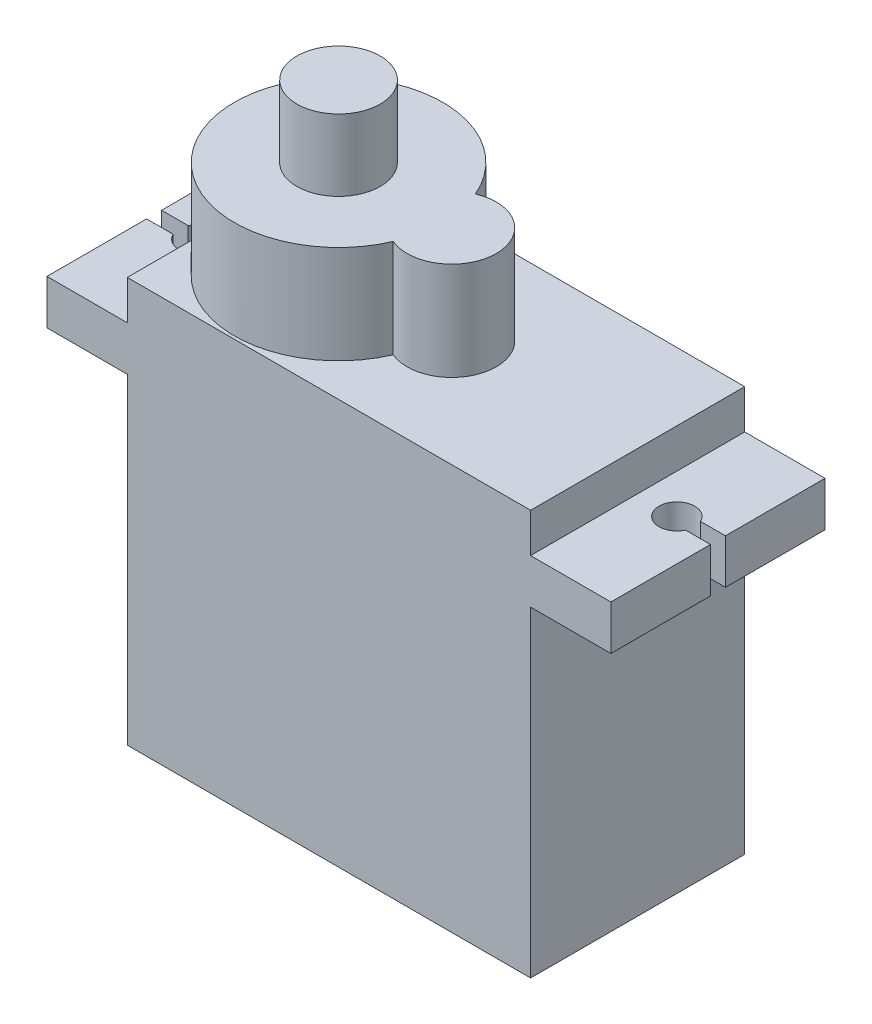
ISO-10303-21;
HEADER;
FILE_DESCRIPTION(('STEP AP214'),'2;1');
FILE_NAME('part.step','',(''),(''),'','','');
FILE_SCHEMA(('AUTOMOTIVE_DESIGN { 1 0 10303 214 1 1 1 1 }'));
ENDSEC;
DATA;
#1=APPLICATION_CONTEXT('core data for automotive mechanical design processes');
#2=APPLICATION_PROTOCOL_DEFINITION('international standard','automotive_design',2000,#1);
#3=PRODUCT_CONTEXT('',#1,'mechanical');
#4=PRODUCT('Part','Part','',(#3));
#5=PRODUCT_RELATED_PRODUCT_CATEGORY('part','',(#4));
#6=PRODUCT_DEFINITION_FORMATION('','',#4);
#7=PRODUCT_DEFINITION_CONTEXT('part definition',#1,'design');
#8=PRODUCT_DEFINITION('design','',#6,#7);
#9=PRODUCT_DEFINITION_SHAPE('','',#8);
#10=(LENGTH_UNIT() NAMED_UNIT(*) SI_UNIT(.MILLI.,.METRE.));
#11=(NAMED_UNIT(*) PLANE_ANGLE_UNIT() SI_UNIT($,.RADIAN.));
#12=(NAMED_UNIT(*) SI_UNIT($,.STERADIAN.) SOLID_ANGLE_UNIT());
#13=UNCERTAINTY_MEASURE_WITH_UNIT(LENGTH_MEASURE(1.E-05),#10,'distance_accuracy_value','');
#14=(GEOMETRIC_REPRESENTATION_CONTEXT(3) GLOBAL_UNCERTAINTY_ASSIGNED_CONTEXT((#13)) GLOBAL_UNIT_ASSIGNED_CONTEXT((#10,
#11,#12)) REPRESENTATION_CONTEXT('',''));
#15=CARTESIAN_POINT('',(0.,0.,0.));
#16=DIRECTION('',(0.,0.,1.));
#17=DIRECTION('',(1.,0.,0.));
#18=AXIS2_PLACEMENT_3D('',#15,#16,#17);
#19=CARTESIAN_POINT('',(-50.695532413833,18.,0.));
#20=DIRECTION('',(0.,-1.,0.));
#21=DIRECTION('',(0.,0.,-1.));
#22=AXIS2_PLACEMENT_3D('',#19,#20,#21);
#23=PLANE('',#22);
#24=CARTESIAN_POINT('',(-48.295532413833,18.,1.25686180578578));
#25=DIRECTION('',(0.,-1.,0.));
#26=DIRECTION('',(0.,0.,-1.));
#27=AXIS2_PLACEMENT_3D('',#24,#25,#26);
#28=CIRCLE('',#27,0.999999999999998);
#29=CARTESIAN_POINT('',(-49.2030565181961,18.,0.836861805785775));
#30=VERTEX_POINT('',#29);
#31=CARTESIAN_POINT('',(-49.2030565181961,18.,1.67686180578578));
#32=VERTEX_POINT('',#31);
#33=EDGE_CURVE('E225',#30,#32,#28,.T.);
#34=ORIENTED_EDGE('',*,*,#33,.F.);
#35=DIRECTION('',(-1.,0.,0.));
#36=VECTOR('',#35,1.);
#37=CARTESIAN_POINT('',(-50.695532413833,18.,0.836861805785776));
#38=LINE('',#37,#36);
#39=CARTESIAN_POINT('',(-50.695532413833,18.,0.836861805785776));
#40=VERTEX_POINT('',#39);
#41=EDGE_CURVE('E394',#30,#40,#38,.T.);
#42=ORIENTED_EDGE('',*,*,#41,.T.);
#43=DIRECTION('',(0.,0.,-1.));
#44=VECTOR('',#43,1.);
#45=CARTESIAN_POINT('',(-50.695532413833,18.,0.));
#46=LINE('',#45,#44);
#47=CARTESIAN_POINT('',(-50.695532413833,18.,-4.74313819421423));
#48=VERTEX_POINT('',#47);
#49=EDGE_CURVE('E228',#40,#48,#46,.T.);
#50=ORIENTED_EDGE('',*,*,#49,.T.);
#51=DIRECTION('',(1.,0.,0.));
#52=VECTOR('',#51,1.);
#53=CARTESIAN_POINT('',(-50.695532413833,18.,-4.74313819421423));
#54=LINE('',#53,#52);
#55=CARTESIAN_POINT('',(-46.195532413833,18.,-4.74313819421423));
#56=VERTEX_POINT('',#55);
#57=EDGE_CURVE('E217',#48,#56,#54,.T.);
#58=ORIENTED_EDGE('',*,*,#57,.T.);
#59=DIRECTION('',(0.,0.,-1.));
#60=VECTOR('',#59,1.);
#61=CARTESIAN_POINT('',(-46.195532413833,18.,0.));
#62=LINE('',#61,#60);
#63=CARTESIAN_POINT('',(-46.195532413833,18.,7.25686180578577));
#64=VERTEX_POINT('',#63);
#65=EDGE_CURVE('E222',#64,#56,#62,.T.);
#66=ORIENTED_EDGE('',*,*,#65,.F.);
#67=DIRECTION('',(1.,0.,0.));
#68=VECTOR('',#67,1.);
#69=CARTESIAN_POINT('',(-50.695532413833,18.,7.25686180578577));
#70=LINE('',#69,#68);
#71=CARTESIAN_POINT('',(-50.695532413833,18.,7.25686180578577));
#72=VERTEX_POINT('',#71);
#73=EDGE_CURVE('E236',#72,#64,#70,.T.);
#74=ORIENTED_EDGE('',*,*,#73,.F.);
#75=CARTESIAN_POINT('',(-50.695532413833,18.,1.67686180578578));
#76=VERTEX_POINT('',#75);
#77=EDGE_CURVE('E397',#72,#76,#46,.T.);
#78=ORIENTED_EDGE('',*,*,#77,.T.);
#79=DIRECTION('',(-1.,0.,0.));
#80=VECTOR('',#79,1.);
#81=CARTESIAN_POINT('',(-50.695532413833,18.,1.67686180578578));
#82=LINE('',#81,#80);
#83=EDGE_CURVE('E54',#32,#76,#82,.T.);
#84=ORIENTED_EDGE('',*,*,#83,.F.);
#85=EDGE_LOOP('',(#34,#42,#50,#58,#66,#74,#78,#84));
#86=FACE_BOUND('',#85,.T.);
#87=ADVANCED_FACE('F39',(#86),#23,.T.);
#88=CARTESIAN_POINT('',(-50.695532413833,20.5,0.));
#89=DIRECTION('',(0.,-1.,0.));
#90=DIRECTION('',(0.,0.,-1.));
#91=AXIS2_PLACEMENT_3D('',#88,#89,#90);
#92=PLANE('',#91);
#93=DIRECTION('',(1.,0.,0.));
#94=VECTOR('',#93,1.);
#95=CARTESIAN_POINT('',(0.,20.5,0.83686180578576));
#96=LINE('',#95,#94);
#97=CARTESIAN_POINT('',(-50.695532413833,20.5,0.836861805785775));
#98=VERTEX_POINT('',#97);
#99=CARTESIAN_POINT('',(-49.2030565181961,20.5,0.836861805785774));
#100=VERTEX_POINT('',#99);
#101=EDGE_CURVE('E384',#98,#100,#96,.T.);
#102=ORIENTED_EDGE('',*,*,#101,.T.);
#103=CARTESIAN_POINT('',(-48.295532413833,20.5,1.25686180578578));
#104=DIRECTION('',(0.,1.,0.));
#105=DIRECTION('',(0.,0.,1.));
#106=AXIS2_PLACEMENT_3D('',#103,#104,#105);
#107=CIRCLE('',#106,0.999999999999998);
#108=CARTESIAN_POINT('',(-49.2030565181961,20.5,1.67686180578578));
#109=VERTEX_POINT('',#108);
#110=EDGE_CURVE('E207',#109,#100,#107,.T.);
#111=ORIENTED_EDGE('',*,*,#110,.F.);
#112=DIRECTION('',(1.,0.,0.));
#113=VECTOR('',#112,1.);
#114=CARTESIAN_POINT('',(0.,20.5,1.67686180578578));
#115=LINE('',#114,#113);
#116=CARTESIAN_POINT('',(-50.695532413833,20.5,1.67686180578578));
#117=VERTEX_POINT('',#116);
#118=EDGE_CURVE('E193',#117,#109,#115,.T.);
#119=ORIENTED_EDGE('',*,*,#118,.F.);
#120=DIRECTION('',(0.,0.,-1.));
#121=VECTOR('',#120,1.);
#122=CARTESIAN_POINT('',(-50.695532413833,20.5,0.));
#123=LINE('',#122,#121);
#124=CARTESIAN_POINT('',(-50.695532413833,20.5,7.25686180578577));
#125=VERTEX_POINT('',#124);
#126=EDGE_CURVE('E205',#125,#117,#123,.T.);
#127=ORIENTED_EDGE('',*,*,#126,.F.);
#128=DIRECTION('',(1.,0.,0.));
#129=VECTOR('',#128,1.);
#130=CARTESIAN_POINT('',(-50.695532413833,20.5,7.25686180578577));
#131=LINE('',#130,#129);
#132=CARTESIAN_POINT('',(-46.195532413833,20.5,7.25686180578577));
#133=VERTEX_POINT('',#132);
#134=EDGE_CURVE('E234',#125,#133,#131,.T.);
#135=ORIENTED_EDGE('',*,*,#134,.T.);
#136=DIRECTION('',(0.,0.,-1.));
#137=VECTOR('',#136,1.);
#138=CARTESIAN_POINT('',(-46.195532413833,20.5,0.));
#139=LINE('',#138,#137);
#140=CARTESIAN_POINT('',(-46.195532413833,20.5,-4.74313819421423));
#141=VERTEX_POINT('',#140);
#142=EDGE_CURVE('E224',#133,#141,#139,.T.);
#143=ORIENTED_EDGE('',*,*,#142,.T.);
#144=DIRECTION('',(1.,0.,0.));
#145=VECTOR('',#144,1.);
#146=CARTESIAN_POINT('',(-50.695532413833,20.5,-4.74313819421423));
#147=LINE('',#146,#145);
#148=CARTESIAN_POINT('',(-50.695532413833,20.5,-4.74313819421423));
#149=VERTEX_POINT('',#148);
#150=EDGE_CURVE('E231',#149,#141,#147,.T.);
#151=ORIENTED_EDGE('',*,*,#150,.F.);
#152=EDGE_CURVE('E214',#98,#149,#123,.T.);
#153=ORIENTED_EDGE('',*,*,#152,.F.);
#154=EDGE_LOOP('',(#102,#111,#119,#127,#135,#143,#151,#153));
#155=FACE_BOUND('',#154,.T.);
#156=ADVANCED_FACE('F203',(#155),#92,.F.);
#157=CARTESIAN_POINT('',(-50.695532413833,0.,0.));
#158=DIRECTION('',(-1.,0.,0.));
#159=DIRECTION('',(0.,0.,1.));
#160=AXIS2_PLACEMENT_3D('',#157,#158,#159);
#161=PLANE('',#160);
#162=ORIENTED_EDGE('',*,*,#49,.F.);
#163=DIRECTION('',(0.,1.,0.));
#164=VECTOR('',#163,1.);
#165=CARTESIAN_POINT('',(-50.695532413833,0.,0.836861805785781));
#166=LINE('',#165,#164);
#167=EDGE_CURVE('E12',#40,#98,#166,.T.);
#168=ORIENTED_EDGE('',*,*,#167,.T.);
#169=ORIENTED_EDGE('',*,*,#152,.T.);
#170=DIRECTION('',(0.,-1.,0.));
#171=VECTOR('',#170,1.);
#172=CARTESIAN_POINT('',(-50.695532413833,0.,-4.74313819421423));
#173=LINE('',#172,#171);
#174=EDGE_CURVE('E213',#149,#48,#173,.T.);
#175=ORIENTED_EDGE('',*,*,#174,.T.);
#176=EDGE_LOOP('',(#162,#168,#169,#175));
#177=FACE_BOUND('',#176,.T.);
#178=ADVANCED_FACE('F383',(#177),#161,.T.);
#179=CARTESIAN_POINT('',(-46.195532413833,22.7,-4.74313819421423));
#180=DIRECTION('',(1.,0.,0.));
#181=DIRECTION('',(0.,0.,-1.));
#182=AXIS2_PLACEMENT_3D('',#179,#180,#181);
#183=PLANE('',#182);
#184=ORIENTED_EDGE('',*,*,#142,.F.);
#185=DIRECTION('',(0.,-1.,0.));
#186=VECTOR('',#185,1.);
#187=CARTESIAN_POINT('',(-46.195532413833,22.7,7.25686180578577));
#188=LINE('',#187,#186);
#189=CARTESIAN_POINT('',(-46.195532413833,22.7,7.25686180578577));
#190=VERTEX_POINT('',#189);
#191=EDGE_CURVE('E310',#190,#133,#188,.T.);
#192=ORIENTED_EDGE('',*,*,#191,.F.);
#193=DIRECTION('',(0.,0.,1.));
#194=VECTOR('',#193,1.);
#195=CARTESIAN_POINT('',(-46.195532413833,22.7,-4.74313819421423));
#196=LINE('',#195,#194);
#197=CARTESIAN_POINT('',(-46.195532413833,22.7,1.25686180578577));
#198=VERTEX_POINT('',#197);
#199=EDGE_CURVE('E668',#198,#190,#196,.T.);
#200=ORIENTED_EDGE('',*,*,#199,.F.);
#201=CARTESIAN_POINT('',(-46.195532413833,22.7,-4.74313819421423));
#202=VERTEX_POINT('',#201);
#203=EDGE_CURVE('E683',#202,#198,#196,.T.);
#204=ORIENTED_EDGE('',*,*,#203,.F.);
#205=DIRECTION('',(0.,-1.,0.));
#206=VECTOR('',#205,1.);
#207=CARTESIAN_POINT('',(-46.195532413833,22.7,-4.74313819421423));
#208=LINE('',#207,#206);
#209=EDGE_CURVE('E359',#202,#141,#208,.T.);
#210=ORIENTED_EDGE('',*,*,#209,.T.);
#211=EDGE_LOOP('',(#184,#192,#200,#204,#210));
#212=FACE_BOUND('',#211,.T.);
#213=ADVANCED_FACE('F435',(#212),#183,.F.);
#214=CARTESIAN_POINT('',(-19.095532413833,18.,0.));
#215=DIRECTION('',(0.,1.,0.));
#216=DIRECTION('',(0.,0.,1.));
#217=AXIS2_PLACEMENT_3D('',#214,#215,#216);
#218=PLANE('',#217);
#219=DIRECTION('',(-1.,0.,0.));
#220=VECTOR('',#219,1.);
#221=CARTESIAN_POINT('',(-19.095532413833,18.,1.67686180578577));
#222=LINE('',#221,#220);
#223=CARTESIAN_POINT('',(-19.095532413833,18.,1.67686180578577));
#224=VERTEX_POINT('',#223);
#225=CARTESIAN_POINT('',(-20.4880083094699,18.,1.67686180578577));
#226=VERTEX_POINT('',#225);
#227=EDGE_CURVE('E254',#224,#226,#222,.T.);
#228=ORIENTED_EDGE('',*,*,#227,.F.);
#229=DIRECTION('',(0.,0.,-1.));
#230=VECTOR('',#229,1.);
#231=CARTESIAN_POINT('',(-19.095532413833,18.,0.));
#232=LINE('',#231,#230);
#233=CARTESIAN_POINT('',(-19.095532413833,18.,7.25686180578577));
#234=VERTEX_POINT('',#233);
#235=EDGE_CURVE('E265',#234,#224,#232,.T.);
#236=ORIENTED_EDGE('',*,*,#235,.F.);
#237=DIRECTION('',(-1.,0.,0.));
#238=VECTOR('',#237,1.);
#239=CARTESIAN_POINT('',(-19.095532413833,18.,7.25686180578577));
#240=LINE('',#239,#238);
#241=CARTESIAN_POINT('',(-23.595532413833,18.,7.25686180578577));
#242=VERTEX_POINT('',#241);
#243=EDGE_CURVE('E290',#234,#242,#240,.T.);
#244=ORIENTED_EDGE('',*,*,#243,.T.);
#245=DIRECTION('',(0.,0.,-1.));
#246=VECTOR('',#245,1.);
#247=CARTESIAN_POINT('',(-23.595532413833,18.,0.));
#248=LINE('',#247,#246);
#249=CARTESIAN_POINT('',(-23.595532413833,18.,-4.74313819421423));
#250=VERTEX_POINT('',#249);
#251=EDGE_CURVE('E259',#242,#250,#248,.T.);
#252=ORIENTED_EDGE('',*,*,#251,.T.);
#253=DIRECTION('',(-1.,0.,0.));
#254=VECTOR('',#253,1.);
#255=CARTESIAN_POINT('',(-19.095532413833,18.,-4.74313819421423));
#256=LINE('',#255,#254);
#257=CARTESIAN_POINT('',(-19.095532413833,18.,-4.74313819421423));
#258=VERTEX_POINT('',#257);
#259=EDGE_CURVE('E287',#258,#250,#256,.T.);
#260=ORIENTED_EDGE('',*,*,#259,.F.);
#261=CARTESIAN_POINT('',(-19.095532413833,18.,0.836861805785775));
#262=VERTEX_POINT('',#261);
#263=EDGE_CURVE('E263',#262,#258,#232,.T.);
#264=ORIENTED_EDGE('',*,*,#263,.F.);
#265=DIRECTION('',(-1.,0.,0.));
#266=VECTOR('',#265,1.);
#267=CARTESIAN_POINT('',(-19.095532413833,18.,0.836861805785775));
#268=LINE('',#267,#266);
#269=CARTESIAN_POINT('',(-20.4880083094699,18.,0.836861805785775));
#270=VERTEX_POINT('',#269);
#271=EDGE_CURVE('E250',#262,#270,#268,.T.);
#272=ORIENTED_EDGE('',*,*,#271,.T.);
#273=CARTESIAN_POINT('',(-21.395532413833,18.,1.25686180578577));
#274=DIRECTION('',(0.,1.,0.));
#275=DIRECTION('',(0.,0.,1.));
#276=AXIS2_PLACEMENT_3D('',#273,#274,#275);
#277=CIRCLE('',#276,1.);
#278=EDGE_CURVE('E256',#270,#226,#277,.T.);
#279=ORIENTED_EDGE('',*,*,#278,.T.);
#280=EDGE_LOOP('',(#228,#236,#244,#252,#260,#264,#272,#279));
#281=FACE_BOUND('',#280,.T.);
#282=ADVANCED_FACE('F329',(#281),#218,.F.);
#283=CARTESIAN_POINT('',(-19.095532413833,20.5,0.));
#284=DIRECTION('',(0.,1.,0.));
#285=DIRECTION('',(0.,0.,1.));
#286=AXIS2_PLACEMENT_3D('',#283,#284,#285);
#287=PLANE('',#286);
#288=DIRECTION('',(0.,0.,-1.));
#289=VECTOR('',#288,1.);
#290=CARTESIAN_POINT('',(-19.095532413833,20.5,0.));
#291=LINE('',#290,#289);
#292=CARTESIAN_POINT('',(-19.095532413833,20.5,7.25686180578577));
#293=VERTEX_POINT('',#292);
#294=CARTESIAN_POINT('',(-19.095532413833,20.5,1.67686180578577));
#295=VERTEX_POINT('',#294);
#296=EDGE_CURVE('E272',#293,#295,#291,.T.);
#297=ORIENTED_EDGE('',*,*,#296,.T.);
#298=DIRECTION('',(-1.,0.,0.));
#299=VECTOR('',#298,1.);
#300=CARTESIAN_POINT('',(0.,20.5,1.67686180578577));
#301=LINE('',#300,#299);
#302=CARTESIAN_POINT('',(-20.4880083094699,20.5,1.67686180578577));
#303=VERTEX_POINT('',#302);
#304=EDGE_CURVE('E244',#295,#303,#301,.T.);
#305=ORIENTED_EDGE('',*,*,#304,.T.);
#306=CARTESIAN_POINT('',(-21.395532413833,20.5,1.25686180578577));
#307=DIRECTION('',(0.,1.,0.));
#308=DIRECTION('',(0.,0.,1.));
#309=AXIS2_PLACEMENT_3D('',#306,#307,#308);
#310=CIRCLE('',#309,1.);
#311=CARTESIAN_POINT('',(-20.4880083094699,20.5,0.836861805785775));
#312=VERTEX_POINT('',#311);
#313=EDGE_CURVE('E241',#312,#303,#310,.T.);
#314=ORIENTED_EDGE('',*,*,#313,.F.);
#315=DIRECTION('',(-1.,0.,0.));
#316=VECTOR('',#315,1.);
#317=CARTESIAN_POINT('',(0.,20.5,0.836861805785775));
#318=LINE('',#317,#316);
#319=CARTESIAN_POINT('',(-19.095532413833,20.5,0.836861805785775));
#320=VERTEX_POINT('',#319);
#321=EDGE_CURVE('E238',#320,#312,#318,.T.);
#322=ORIENTED_EDGE('',*,*,#321,.F.);
#323=CARTESIAN_POINT('',(-19.095532413833,20.5,-4.74313819421423));
#324=VERTEX_POINT('',#323);
#325=EDGE_CURVE('E271',#320,#324,#291,.T.);
#326=ORIENTED_EDGE('',*,*,#325,.T.);
#327=DIRECTION('',(-1.,0.,0.));
#328=VECTOR('',#327,1.);
#329=CARTESIAN_POINT('',(-19.095532413833,20.5,-4.74313819421423));
#330=LINE('',#329,#328);
#331=CARTESIAN_POINT('',(-23.595532413833,20.5,-4.74313819421423));
#332=VERTEX_POINT('',#331);
#333=EDGE_CURVE('E291',#324,#332,#330,.T.);
#334=ORIENTED_EDGE('',*,*,#333,.T.);
#335=DIRECTION('',(0.,0.,-1.));
#336=VECTOR('',#335,1.);
#337=CARTESIAN_POINT('',(-23.595532413833,20.5,0.));
#338=LINE('',#337,#336);
#339=CARTESIAN_POINT('',(-23.595532413833,20.5,7.25686180578577));
#340=VERTEX_POINT('',#339);
#341=EDGE_CURVE('E264',#340,#332,#338,.T.);
#342=ORIENTED_EDGE('',*,*,#341,.F.);
#343=DIRECTION('',(-1.,0.,0.));
#344=VECTOR('',#343,1.);
#345=CARTESIAN_POINT('',(-19.095532413833,20.5,7.25686180578577));
#346=LINE('',#345,#344);
#347=EDGE_CURVE('E275',#293,#340,#346,.T.);
#348=ORIENTED_EDGE('',*,*,#347,.F.);
#349=EDGE_LOOP('',(#297,#305,#314,#322,#326,#334,#342,#348));
#350=FACE_BOUND('',#349,.T.);
#351=ADVANCED_FACE('F318',(#350),#287,.T.);
#352=CARTESIAN_POINT('',(-19.095532413833,0.,0.));
#353=DIRECTION('',(1.,0.,0.));
#354=DIRECTION('',(0.,0.,-1.));
#355=AXIS2_PLACEMENT_3D('',#352,#353,#354);
#356=PLANE('',#355);
#357=ORIENTED_EDGE('',*,*,#235,.T.);
#358=DIRECTION('',(0.,1.,0.));
#359=VECTOR('',#358,1.);
#360=CARTESIAN_POINT('',(-19.095532413833,0.,1.67686180578577));
#361=LINE('',#360,#359);
#362=EDGE_CURVE('E199',#224,#295,#361,.T.);
#363=ORIENTED_EDGE('',*,*,#362,.T.);
#364=ORIENTED_EDGE('',*,*,#296,.F.);
#365=DIRECTION('',(0.,-1.,0.));
#366=VECTOR('',#365,1.);
#367=CARTESIAN_POINT('',(-19.095532413833,0.,7.25686180578577));
#368=LINE('',#367,#366);
#369=EDGE_CURVE('E260',#293,#234,#368,.T.);
#370=ORIENTED_EDGE('',*,*,#369,.T.);
#371=EDGE_LOOP('',(#357,#363,#364,#370));
#372=FACE_BOUND('',#371,.T.);
#373=ADVANCED_FACE('F314',(#372),#356,.T.);
#374=CARTESIAN_POINT('',(-23.595532413833,22.7,-4.74313819421423));
#375=DIRECTION('',(-1.,0.,0.));
#376=DIRECTION('',(0.,0.,1.));
#377=AXIS2_PLACEMENT_3D('',#374,#375,#376);
#378=PLANE('',#377);
#379=ORIENTED_EDGE('',*,*,#251,.F.);
#380=DIRECTION('',(0.,-1.,0.));
#381=VECTOR('',#380,1.);
#382=CARTESIAN_POINT('',(-23.595532413833,22.7,7.25686180578577));
#383=LINE('',#382,#381);
#384=CARTESIAN_POINT('',(-23.595532413833,0.,7.25686180578577));
#385=VERTEX_POINT('',#384);
#386=EDGE_CURVE('E284',#242,#385,#383,.T.);
#387=ORIENTED_EDGE('',*,*,#386,.T.);
#388=DIRECTION('',(0.,0.,-1.));
#389=VECTOR('',#388,1.);
#390=CARTESIAN_POINT('',(-23.595532413833,0.,-4.74313819421423));
#391=LINE('',#390,#389);
#392=CARTESIAN_POINT('',(-23.595532413833,0.,-4.74313819421423));
#393=VERTEX_POINT('',#392);
#394=EDGE_CURVE('E663',#385,#393,#391,.T.);
#395=ORIENTED_EDGE('',*,*,#394,.T.);
#396=DIRECTION('',(0.,-1.,0.));
#397=VECTOR('',#396,1.);
#398=CARTESIAN_POINT('',(-23.595532413833,22.7,-4.74313819421423));
#399=LINE('',#398,#397);
#400=EDGE_CURVE('E356',#250,#393,#399,.T.);
#401=ORIENTED_EDGE('',*,*,#400,.F.);
#402=EDGE_LOOP('',(#379,#387,#395,#401));
#403=FACE_BOUND('',#402,.T.);
#404=ADVANCED_FACE('F455',(#403),#378,.F.);
#405=CARTESIAN_POINT('',(-40.355532413833,28.2,1.25686180578577));
#406=DIRECTION('',(0.,-1.,0.));
#407=DIRECTION('',(0.,0.,-1.));
#408=AXIS2_PLACEMENT_3D('',#405,#406,#407);
#409=CYLINDRICAL_SURFACE('',#408,5.84);
#410=DIRECTION('',(0.,-1.,0.));
#411=VECTOR('',#410,1.);
#412=CARTESIAN_POINT('',(-34.9887185337068,28.2,3.5596663515701));
#413=LINE('',#412,#411);
#414=CARTESIAN_POINT('',(-34.9887185337068,28.2,3.5596663515701));
#415=VERTEX_POINT('',#414);
#416=CARTESIAN_POINT('',(-34.9887185337068,22.7,3.5596663515701));
#417=VERTEX_POINT('',#416);
#418=EDGE_CURVE('E693',#415,#417,#413,.T.);
#419=ORIENTED_EDGE('',*,*,#418,.F.);
#420=CARTESIAN_POINT('',(-40.355532413833,28.2,1.25686180578577));
#421=DIRECTION('',(0.,1.,0.));
#422=DIRECTION('',(0.,0.,1.));
#423=AXIS2_PLACEMENT_3D('',#420,#421,#422);
#424=CIRCLE('',#423,5.84);
#425=CARTESIAN_POINT('',(-34.9887185337068,28.2,-1.04594273999855));
#426=VERTEX_POINT('',#425);
#427=EDGE_CURVE('E671',#426,#415,#424,.T.);
#428=ORIENTED_EDGE('',*,*,#427,.F.);
#429=DIRECTION('',(0.,-1.,0.));
#430=VECTOR('',#429,1.);
#431=CARTESIAN_POINT('',(-34.9887185337068,28.2,-1.04594273999855));
#432=LINE('',#431,#430);
#433=CARTESIAN_POINT('',(-34.9887185337068,22.7,-1.04594273999855));
#434=VERTEX_POINT('',#433);
#435=EDGE_CURVE('E697',#426,#434,#432,.T.);
#436=ORIENTED_EDGE('',*,*,#435,.T.);
#437=CARTESIAN_POINT('',(-40.355532413833,22.7,1.25686180578577));
#438=DIRECTION('',(0.,1.,0.));
#439=DIRECTION('',(0.,0.,1.));
#440=AXIS2_PLACEMENT_3D('',#437,#438,#439);
#441=CIRCLE('',#440,5.84);
#442=EDGE_CURVE('E687',#434,#198,#441,.T.);
#443=ORIENTED_EDGE('',*,*,#442,.T.);
#444=EDGE_CURVE('E675',#198,#417,#441,.T.);
#445=ORIENTED_EDGE('',*,*,#444,.T.);
#446=EDGE_LOOP('',(#419,#428,#436,#443,#445));
#447=FACE_BOUND('',#446,.T.);
#448=ADVANCED_FACE('F452',(#447),#409,.T.);
#449=CARTESIAN_POINT('',(-46.195532413833,0.,7.25686180578577));
#450=VERTEX_POINT('',#449);
#451=EDGE_CURVE('E62',#64,#450,#188,.T.);
#452=ORIENTED_EDGE('',*,*,#451,.F.);
#453=ORIENTED_EDGE('',*,*,#65,.T.);
#454=CARTESIAN_POINT('',(-46.195532413833,0.,-4.74313819421423));
#455=VERTEX_POINT('',#454);
#456=EDGE_CURVE('E667',#56,#455,#208,.T.);
#457=ORIENTED_EDGE('',*,*,#456,.T.);
#458=DIRECTION('',(0.,0.,1.));
#459=VECTOR('',#458,1.);
#460=CARTESIAN_POINT('',(-46.195532413833,0.,-4.74313819421423));
#461=LINE('',#460,#459);
#462=EDGE_CURVE('E669',#455,#450,#461,.T.);
#463=ORIENTED_EDGE('',*,*,#462,.T.);
#464=EDGE_LOOP('',(#452,#453,#457,#463));
#465=FACE_BOUND('',#464,.T.);
#466=ADVANCED_FACE('F41',(#465),#183,.F.);
#467=CARTESIAN_POINT('',(-46.195532413833,22.7,7.25686180578577));
#468=DIRECTION('',(0.,0.,-1.));
#469=DIRECTION('',(-1.,0.,0.));
#470=AXIS2_PLACEMENT_3D('',#467,#468,#469);
#471=PLANE('',#470);
#472=DIRECTION('',(1.,0.,0.));
#473=VECTOR('',#472,1.);
#474=CARTESIAN_POINT('',(-46.195532413833,0.,7.25686180578577));
#475=LINE('',#474,#473);
#476=EDGE_CURVE('E670',#450,#385,#475,.T.);
#477=ORIENTED_EDGE('',*,*,#476,.T.);
#478=ORIENTED_EDGE('',*,*,#386,.F.);
#479=ORIENTED_EDGE('',*,*,#243,.F.);
#480=ORIENTED_EDGE('',*,*,#369,.F.);
#481=ORIENTED_EDGE('',*,*,#347,.T.);
#482=CARTESIAN_POINT('',(-23.595532413833,22.7,7.25686180578577));
#483=VERTEX_POINT('',#482);
#484=EDGE_CURVE('E358',#483,#340,#383,.T.);
#485=ORIENTED_EDGE('',*,*,#484,.F.);
#486=DIRECTION('',(1.,0.,0.));
#487=VECTOR('',#486,1.);
#488=CARTESIAN_POINT('',(-46.195532413833,22.7,7.25686180578577));
#489=LINE('',#488,#487);
#490=EDGE_CURVE('E373',#190,#483,#489,.T.);
#491=ORIENTED_EDGE('',*,*,#490,.F.);
#492=ORIENTED_EDGE('',*,*,#191,.T.);
#493=ORIENTED_EDGE('',*,*,#134,.F.);
#494=DIRECTION('',(0.,1.,0.));
#495=VECTOR('',#494,1.);
#496=CARTESIAN_POINT('',(-50.695532413833,0.,7.25686180578577));
#497=LINE('',#496,#495);
#498=EDGE_CURVE('E211',#72,#125,#497,.T.);
#499=ORIENTED_EDGE('',*,*,#498,.F.);
#500=ORIENTED_EDGE('',*,*,#73,.T.);
#501=ORIENTED_EDGE('',*,*,#451,.T.);
#502=EDGE_LOOP('',(#477,#478,#479,#480,#481,#485,#491,#492,#493,#499,#500,#501));
#503=FACE_BOUND('',#502,.T.);
#504=ADVANCED_FACE('F326',(#503),#471,.F.);
#505=ORIENTED_EDGE('',*,*,#484,.T.);
#506=ORIENTED_EDGE('',*,*,#341,.T.);
#507=CARTESIAN_POINT('',(-23.595532413833,22.7,-4.74313819421423));
#508=VERTEX_POINT('',#507);
#509=EDGE_CURVE('E351',#508,#332,#399,.T.);
#510=ORIENTED_EDGE('',*,*,#509,.F.);
#511=DIRECTION('',(0.,0.,-1.));
#512=VECTOR('',#511,1.);
#513=CARTESIAN_POINT('',(-23.595532413833,22.7,-4.74313819421423));
#514=LINE('',#513,#512);
#515=EDGE_CURVE('E680',#483,#508,#514,.T.);
#516=ORIENTED_EDGE('',*,*,#515,.F.);
#517=EDGE_LOOP('',(#505,#506,#510,#516));
#518=FACE_BOUND('',#517,.T.);
#519=ADVANCED_FACE('F466',(#518),#378,.F.);
#520=CARTESIAN_POINT('',(-46.195532413833,22.7,-4.74313819421423));
#521=DIRECTION('',(0.,0.,1.));
#522=DIRECTION('',(1.,0.,0.));
#523=AXIS2_PLACEMENT_3D('',#520,#521,#522);
#524=PLANE('',#523);
#525=DIRECTION('',(-1.,0.,0.));
#526=VECTOR('',#525,1.);
#527=CARTESIAN_POINT('',(-46.195532413833,0.,-4.74313819421423));
#528=LINE('',#527,#526);
#529=EDGE_CURVE('E665',#393,#455,#528,.T.);
#530=ORIENTED_EDGE('',*,*,#529,.T.);
#531=ORIENTED_EDGE('',*,*,#456,.F.);
#532=ORIENTED_EDGE('',*,*,#57,.F.);
#533=ORIENTED_EDGE('',*,*,#174,.F.);
#534=ORIENTED_EDGE('',*,*,#150,.T.);
#535=ORIENTED_EDGE('',*,*,#209,.F.);
#536=DIRECTION('',(-1.,0.,0.));
#537=VECTOR('',#536,1.);
#538=CARTESIAN_POINT('',(-46.195532413833,22.7,-4.74313819421423));
#539=LINE('',#538,#537);
#540=EDGE_CURVE('E353',#508,#202,#539,.T.);
#541=ORIENTED_EDGE('',*,*,#540,.F.);
#542=ORIENTED_EDGE('',*,*,#509,.T.);
#543=ORIENTED_EDGE('',*,*,#333,.F.);
#544=DIRECTION('',(0.,1.,0.));
#545=VECTOR('',#544,1.);
#546=CARTESIAN_POINT('',(-19.095532413833,0.,-4.74313819421423));
#547=LINE('',#546,#545);
#548=EDGE_CURVE('E268',#258,#324,#547,.T.);
#549=ORIENTED_EDGE('',*,*,#548,.F.);
#550=ORIENTED_EDGE('',*,*,#259,.T.);
#551=ORIENTED_EDGE('',*,*,#400,.T.);
#552=EDGE_LOOP('',(#530,#531,#532,#533,#534,#535,#541,#542,#543,#549,#550,#551));
#553=FACE_BOUND('',#552,.T.);
#554=ADVANCED_FACE('F348',(#553),#524,.F.);
#555=CARTESIAN_POINT('',(-46.195532413833,22.7,7.25686180578577));
#556=DIRECTION('',(0.,1.,0.));
#557=DIRECTION('',(0.,0.,1.));
#558=AXIS2_PLACEMENT_3D('',#555,#556,#557);
#559=PLANE('',#558);
#560=ORIENTED_EDGE('',*,*,#442,.F.);
#561=CARTESIAN_POINT('',(-34.015532413833,22.7,1.25686180578577));
#562=DIRECTION('',(0.,1.,0.));
#563=DIRECTION('',(0.,0.,1.));
#564=AXIS2_PLACEMENT_3D('',#561,#562,#563);
#565=CIRCLE('',#564,2.5);
#566=EDGE_CURVE('E296',#417,#434,#565,.T.);
#567=ORIENTED_EDGE('',*,*,#566,.F.);
#568=ORIENTED_EDGE('',*,*,#444,.F.);
#569=ORIENTED_EDGE('',*,*,#199,.T.);
#570=ORIENTED_EDGE('',*,*,#490,.T.);
#571=ORIENTED_EDGE('',*,*,#515,.T.);
#572=ORIENTED_EDGE('',*,*,#540,.T.);
#573=ORIENTED_EDGE('',*,*,#203,.T.);
#574=EDGE_LOOP('',(#560,#567,#568,#569,#570,#571,#572,#573));
#575=FACE_BOUND('',#574,.T.);
#576=ADVANCED_FACE('F457',(#575),#559,.T.);
#577=CARTESIAN_POINT('',(-46.195532413833,0.,7.25686180578577));
#578=DIRECTION('',(0.,1.,0.));
#579=DIRECTION('',(0.,0.,1.));
#580=AXIS2_PLACEMENT_3D('',#577,#578,#579);
#581=PLANE('',#580);
#582=ORIENTED_EDGE('',*,*,#462,.F.);
#583=ORIENTED_EDGE('',*,*,#529,.F.);
#584=ORIENTED_EDGE('',*,*,#394,.F.);
#585=ORIENTED_EDGE('',*,*,#476,.F.);
#586=EDGE_LOOP('',(#582,#583,#584,#585));
#587=FACE_BOUND('',#586,.T.);
#588=ADVANCED_FACE('F450',(#587),#581,.F.);
#589=CARTESIAN_POINT('',(0.,28.2,0.));
#590=DIRECTION('',(0.,1.,0.));
#591=DIRECTION('',(0.,0.,1.));
#592=AXIS2_PLACEMENT_3D('',#589,#590,#591);
#593=PLANE('',#592);
#594=CARTESIAN_POINT('',(-40.355532413833,28.2,1.25686180578577));
#595=DIRECTION('',(0.,1.,0.));
#596=DIRECTION('',(0.,0.,1.));
#597=AXIS2_PLACEMENT_3D('',#594,#595,#596);
#598=CIRCLE('',#597,2.33499999999999);
#599=CARTESIAN_POINT('',(-40.355532413833,28.2,3.59186180578577));
#600=VERTEX_POINT('',#599);
#601=EDGE_CURVE('E689',#600,#600,#598,.T.);
#602=ORIENTED_EDGE('',*,*,#601,.F.);
#603=EDGE_LOOP('',(#602));
#604=FACE_BOUND('',#603,.T.);
#605=ORIENTED_EDGE('',*,*,#427,.T.);
#606=CARTESIAN_POINT('',(-34.015532413833,28.2,1.25686180578577));
#607=DIRECTION('',(0.,1.,0.));
#608=DIRECTION('',(0.,0.,1.));
#609=AXIS2_PLACEMENT_3D('',#606,#607,#608);
#610=CIRCLE('',#609,2.5);
#611=EDGE_CURVE('E700',#415,#426,#610,.T.);
#612=ORIENTED_EDGE('',*,*,#611,.T.);
#613=EDGE_LOOP('',(#605,#612));
#614=FACE_BOUND('',#613,.T.);
#615=ADVANCED_FACE('F446',(#604,#614),#593,.T.);
#616=CARTESIAN_POINT('',(-40.355532413833,32.2,1.25686180578577));
#617=DIRECTION('',(0.,-1.,0.));
#618=DIRECTION('',(0.,0.,-1.));
#619=AXIS2_PLACEMENT_3D('',#616,#617,#618);
#620=CYLINDRICAL_SURFACE('',#619,2.33499999999999);
#621=CARTESIAN_POINT('',(-40.355532413833,32.2,1.25686180578577));
#622=DIRECTION('',(0.,1.,0.));
#623=DIRECTION('',(0.,0.,1.));
#624=AXIS2_PLACEMENT_3D('',#621,#622,#623);
#625=CIRCLE('',#624,2.33499999999999);
#626=CARTESIAN_POINT('',(-40.355532413833,32.2,3.59186180578577));
#627=VERTEX_POINT('',#626);
#628=EDGE_CURVE('E692',#627,#627,#625,.T.);
#629=ORIENTED_EDGE('',*,*,#628,.F.);
#630=EDGE_LOOP('',(#629));
#631=FACE_BOUND('',#630,.T.);
#632=ORIENTED_EDGE('',*,*,#601,.T.);
#633=EDGE_LOOP('',(#632));
#634=FACE_BOUND('',#633,.T.);
#635=ADVANCED_FACE('F442',(#631,#634),#620,.T.);
#636=CARTESIAN_POINT('',(-40.355532413833,32.2,1.25686180578577));
#637=DIRECTION('',(0.,1.,0.));
#638=DIRECTION('',(0.,0.,1.));
#639=AXIS2_PLACEMENT_3D('',#636,#637,#638);
#640=PLANE('',#639);
#641=ORIENTED_EDGE('',*,*,#628,.T.);
#642=EDGE_LOOP('',(#641));
#643=FACE_BOUND('',#642,.T.);
#644=ADVANCED_FACE('F438',(#643),#640,.T.);
#645=CARTESIAN_POINT('',(-34.015532413833,28.2,1.25686180578577));
#646=DIRECTION('',(0.,-1.,0.));
#647=DIRECTION('',(0.,0.,-1.));
#648=AXIS2_PLACEMENT_3D('',#645,#646,#647);
#649=CYLINDRICAL_SURFACE('',#648,2.5);
#650=ORIENTED_EDGE('',*,*,#566,.T.);
#651=ORIENTED_EDGE('',*,*,#435,.F.);
#652=ORIENTED_EDGE('',*,*,#611,.F.);
#653=ORIENTED_EDGE('',*,*,#418,.T.);
#654=EDGE_LOOP('',(#650,#651,#652,#653));
#655=FACE_BOUND('',#654,.T.);
#656=ADVANCED_FACE('F430',(#655),#649,.T.);
#657=DIRECTION('',(0.,1.,0.));
#658=VECTOR('',#657,1.);
#659=CARTESIAN_POINT('',(-19.095532413833,0.,0.836861805785775));
#660=LINE('',#659,#658);
#661=EDGE_CURVE('E308',#262,#320,#660,.T.);
#662=ORIENTED_EDGE('',*,*,#661,.F.);
#663=ORIENTED_EDGE('',*,*,#263,.T.);
#664=ORIENTED_EDGE('',*,*,#548,.T.);
#665=ORIENTED_EDGE('',*,*,#325,.F.);
#666=EDGE_LOOP('',(#662,#663,#664,#665));
#667=FACE_BOUND('',#666,.T.);
#668=ADVANCED_FACE('F341',(#667),#356,.T.);
#669=CARTESIAN_POINT('',(-21.395532413833,-2.50000000007189E-05,1.25686180578577));
#670=DIRECTION('',(0.,1.,0.));
#671=DIRECTION('',(0.,0.,1.));
#672=AXIS2_PLACEMENT_3D('',#669,#670,#671);
#673=CYLINDRICAL_SURFACE('',#672,1.);
#674=DIRECTION('',(0.,1.,0.));
#675=VECTOR('',#674,1.);
#676=CARTESIAN_POINT('',(-20.4880083094699,-2.50000000007189E-05,0.836861805785775));
#677=LINE('',#676,#675);
#678=EDGE_CURVE('E247',#270,#312,#677,.T.);
#679=ORIENTED_EDGE('',*,*,#678,.T.);
#680=ORIENTED_EDGE('',*,*,#313,.T.);
#681=DIRECTION('',(0.,1.,0.));
#682=VECTOR('',#681,1.);
#683=CARTESIAN_POINT('',(-20.4880083094699,-2.50000000007189E-05,1.67686180578577));
#684=LINE('',#683,#682);
#685=EDGE_CURVE('E248',#226,#303,#684,.T.);
#686=ORIENTED_EDGE('',*,*,#685,.F.);
#687=ORIENTED_EDGE('',*,*,#278,.F.);
#688=EDGE_LOOP('',(#679,#680,#686,#687));
#689=FACE_BOUND('',#688,.T.);
#690=ADVANCED_FACE('F334',(#689),#673,.F.);
#691=CARTESIAN_POINT('',(0.,-2.50000000007189E-05,1.67686180578577));
#692=DIRECTION('',(0.,0.,-1.));
#693=DIRECTION('',(-1.,0.,0.));
#694=AXIS2_PLACEMENT_3D('',#691,#692,#693);
#695=PLANE('',#694);
#696=ORIENTED_EDGE('',*,*,#227,.T.);
#697=ORIENTED_EDGE('',*,*,#685,.T.);
#698=ORIENTED_EDGE('',*,*,#304,.F.);
#699=ORIENTED_EDGE('',*,*,#362,.F.);
#700=EDGE_LOOP('',(#696,#697,#698,#699));
#701=FACE_BOUND('',#700,.T.);
#702=ADVANCED_FACE('F332',(#701),#695,.T.);
#703=CARTESIAN_POINT('',(0.,-2.50000000007189E-05,0.836861805785775));
#704=DIRECTION('',(0.,0.,-1.));
#705=DIRECTION('',(-1.,0.,0.));
#706=AXIS2_PLACEMENT_3D('',#703,#704,#705);
#707=PLANE('',#706);
#708=ORIENTED_EDGE('',*,*,#661,.T.);
#709=ORIENTED_EDGE('',*,*,#321,.T.);
#710=ORIENTED_EDGE('',*,*,#678,.F.);
#711=ORIENTED_EDGE('',*,*,#271,.F.);
#712=EDGE_LOOP('',(#708,#709,#710,#711));
#713=FACE_BOUND('',#712,.T.);
#714=ADVANCED_FACE('F423',(#713),#707,.F.);
#715=DIRECTION('',(0.,1.,0.));
#716=VECTOR('',#715,1.);
#717=CARTESIAN_POINT('',(-50.695532413833,0.,1.67686180578579));
#718=LINE('',#717,#716);
#719=EDGE_CURVE('E47',#76,#117,#718,.T.);
#720=ORIENTED_EDGE('',*,*,#719,.F.);
#721=ORIENTED_EDGE('',*,*,#77,.F.);
#722=ORIENTED_EDGE('',*,*,#498,.T.);
#723=ORIENTED_EDGE('',*,*,#126,.T.);
#724=EDGE_LOOP('',(#720,#721,#722,#723));
#725=FACE_BOUND('',#724,.T.);
#726=ADVANCED_FACE('F209',(#725),#161,.T.);
#727=CARTESIAN_POINT('',(0.,-2.50000000007189E-05,0.836861805785766));
#728=DIRECTION('',(0.,0.,1.));
#729=DIRECTION('',(0.,-1.,0.));
#730=AXIS2_PLACEMENT_3D('',#727,#728,#729);
#731=PLANE('',#730);
#732=DIRECTION('',(0.,1.,0.));
#733=VECTOR('',#732,1.);
#734=CARTESIAN_POINT('',(-49.2030565181961,-2.50000000007189E-05,0.83686180578578));
#735=LINE('',#734,#733);
#736=EDGE_CURVE('E388',#30,#100,#735,.T.);
#737=ORIENTED_EDGE('',*,*,#736,.T.);
#738=ORIENTED_EDGE('',*,*,#101,.F.);
#739=ORIENTED_EDGE('',*,*,#167,.F.);
#740=ORIENTED_EDGE('',*,*,#41,.F.);
#741=EDGE_LOOP('',(#737,#738,#739,#740));
#742=FACE_BOUND('',#741,.T.);
#743=ADVANCED_FACE('F402',(#742),#731,.T.);
#744=CARTESIAN_POINT('',(-48.295532413833,-2.50000000007189E-05,1.25686180578578));
#745=DIRECTION('',(0.,1.,0.));
#746=DIRECTION('',(0.,0.,1.));
#747=AXIS2_PLACEMENT_3D('',#744,#745,#746);
#748=CYLINDRICAL_SURFACE('',#747,0.999999999999998);
#749=ORIENTED_EDGE('',*,*,#33,.T.);
#750=DIRECTION('',(0.,1.,0.));
#751=VECTOR('',#750,1.);
#752=CARTESIAN_POINT('',(-49.2030565181961,-2.50000000007189E-05,1.67686180578579));
#753=LINE('',#752,#751);
#754=EDGE_CURVE('E386',#32,#109,#753,.T.);
#755=ORIENTED_EDGE('',*,*,#754,.T.);
#756=ORIENTED_EDGE('',*,*,#110,.T.);
#757=ORIENTED_EDGE('',*,*,#736,.F.);
#758=EDGE_LOOP('',(#749,#755,#756,#757));
#759=FACE_BOUND('',#758,.T.);
#760=ADVANCED_FACE('F404',(#759),#748,.F.);
#761=CARTESIAN_POINT('',(0.,-2.50000000007189E-05,1.67686180578579));
#762=DIRECTION('',(0.,0.,1.));
#763=DIRECTION('',(0.,-1.,0.));
#764=AXIS2_PLACEMENT_3D('',#761,#762,#763);
#765=PLANE('',#764);
#766=ORIENTED_EDGE('',*,*,#83,.T.);
#767=ORIENTED_EDGE('',*,*,#719,.T.);
#768=ORIENTED_EDGE('',*,*,#118,.T.);
#769=ORIENTED_EDGE('',*,*,#754,.F.);
#770=EDGE_LOOP('',(#766,#767,#768,#769));
#771=FACE_BOUND('',#770,.T.);
#772=ADVANCED_FACE('F192',(#771),#765,.F.);
#773=CLOSED_SHELL('',(#87,#156,#178,#213,#282,#351,#373,#404,#448,#466,#504,#519,#554,#576,#588,
#615,#635,#644,#656,#668,#690,#702,#714,#726,#743,#760,#772));
#774=MANIFOLD_SOLID_BREP('B2',#773);
#775=ADVANCED_BREP_SHAPE_REPRESENTATION('',(#18,#774),#14);
#776=SHAPE_DEFINITION_REPRESENTATION(#9,#775);
ENDSEC;
END-ISO-10303-21;
